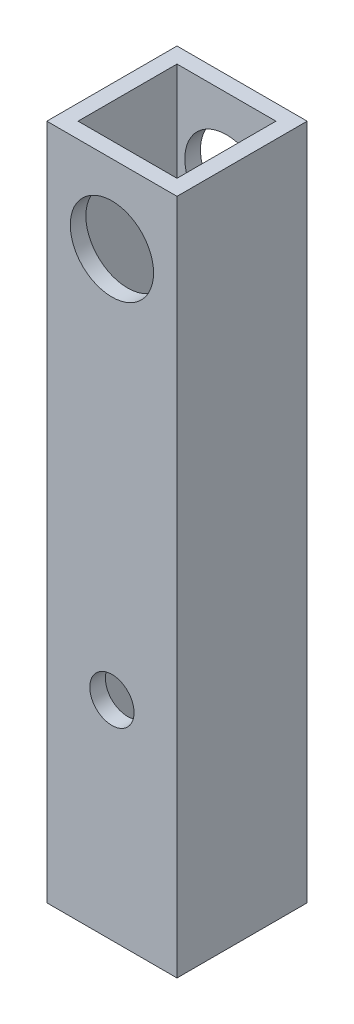
ISO-10303-21;
HEADER;
FILE_DESCRIPTION(('STEP AP214'),'2;1');
FILE_NAME('part.step','',(''),(''),'','','');
FILE_SCHEMA(('AUTOMOTIVE_DESIGN { 1 0 10303 214 1 1 1 1 }'));
ENDSEC;
DATA;
#1=APPLICATION_CONTEXT('core data for automotive mechanical design processes');
#2=APPLICATION_PROTOCOL_DEFINITION('international standard','automotive_design',2000,#1);
#3=PRODUCT_CONTEXT('',#1,'mechanical');
#4=PRODUCT('Part','Part','',(#3));
#5=PRODUCT_RELATED_PRODUCT_CATEGORY('part','',(#4));
#6=PRODUCT_DEFINITION_FORMATION('','',#4);
#7=PRODUCT_DEFINITION_CONTEXT('part definition',#1,'design');
#8=PRODUCT_DEFINITION('design','',#6,#7);
#9=PRODUCT_DEFINITION_SHAPE('','',#8);
#10=(LENGTH_UNIT() NAMED_UNIT(*) SI_UNIT(.MILLI.,.METRE.));
#11=(NAMED_UNIT(*) PLANE_ANGLE_UNIT() SI_UNIT($,.RADIAN.));
#12=(NAMED_UNIT(*) SI_UNIT($,.STERADIAN.) SOLID_ANGLE_UNIT());
#13=UNCERTAINTY_MEASURE_WITH_UNIT(LENGTH_MEASURE(1.E-05),#10,'distance_accuracy_value','');
#14=(GEOMETRIC_REPRESENTATION_CONTEXT(3) GLOBAL_UNCERTAINTY_ASSIGNED_CONTEXT((#13)) GLOBAL_UNIT_ASSIGNED_CONTEXT((#10,
#11,#12)) REPRESENTATION_CONTEXT('',''));
#15=CARTESIAN_POINT('',(0.,0.,0.));
#16=DIRECTION('',(0.,0.,1.));
#17=DIRECTION('',(1.,0.,0.));
#18=AXIS2_PLACEMENT_3D('',#15,#16,#17);
#19=CARTESIAN_POINT('',(0.,130.,0.));
#20=DIRECTION('',(0.,-1.,0.));
#21=DIRECTION('',(0.,0.,-1.));
#22=AXIS2_PLACEMENT_3D('',#19,#20,#21);
#23=PLANE('',#22);
#24=DIRECTION('',(0.,0.,1.));
#25=VECTOR('',#24,1.);
#26=CARTESIAN_POINT('',(0.,130.,0.));
#27=LINE('',#26,#25);
#28=CARTESIAN_POINT('',(0.,130.,-25.));
#29=VERTEX_POINT('',#28);
#30=CARTESIAN_POINT('',(0.,130.,0.));
#31=VERTEX_POINT('',#30);
#32=EDGE_CURVE('E140',#29,#31,#27,.T.);
#33=ORIENTED_EDGE('',*,*,#32,.T.);
#34=DIRECTION('',(1.,0.,0.));
#35=VECTOR('',#34,1.);
#36=CARTESIAN_POINT('',(0.,130.,0.));
#37=LINE('',#36,#35);
#38=CARTESIAN_POINT('',(25.,130.,0.));
#39=VERTEX_POINT('',#38);
#40=EDGE_CURVE('E143',#31,#39,#37,.T.);
#41=ORIENTED_EDGE('',*,*,#40,.T.);
#42=DIRECTION('',(0.,0.,-1.));
#43=VECTOR('',#42,1.);
#44=CARTESIAN_POINT('',(25.,130.,0.));
#45=LINE('',#44,#43);
#46=CARTESIAN_POINT('',(25.,130.,-25.));
#47=VERTEX_POINT('',#46);
#48=EDGE_CURVE('E146',#39,#47,#45,.T.);
#49=ORIENTED_EDGE('',*,*,#48,.T.);
#50=DIRECTION('',(-1.,0.,0.));
#51=VECTOR('',#50,1.);
#52=CARTESIAN_POINT('',(0.,130.,-25.));
#53=LINE('',#52,#51);
#54=EDGE_CURVE('E148',#47,#29,#53,.T.);
#55=ORIENTED_EDGE('',*,*,#54,.T.);
#56=EDGE_LOOP('',(#33,#41,#49,#55));
#57=FACE_BOUND('',#56,.T.);
#58=DIRECTION('',(0.,0.,1.));
#59=VECTOR('',#58,1.);
#60=CARTESIAN_POINT('',(3.,130.,-3.));
#61=LINE('',#60,#59);
#62=CARTESIAN_POINT('',(3.,130.,-22.));
#63=VERTEX_POINT('',#62);
#64=CARTESIAN_POINT('',(3.,130.,-3.));
#65=VERTEX_POINT('',#64);
#66=EDGE_CURVE('E102',#63,#65,#61,.T.);
#67=ORIENTED_EDGE('',*,*,#66,.F.);
#68=DIRECTION('',(-1.,0.,0.));
#69=VECTOR('',#68,1.);
#70=CARTESIAN_POINT('',(3.,130.,-22.));
#71=LINE('',#70,#69);
#72=CARTESIAN_POINT('',(22.,130.,-22.));
#73=VERTEX_POINT('',#72);
#74=EDGE_CURVE('E124',#73,#63,#71,.T.);
#75=ORIENTED_EDGE('',*,*,#74,.F.);
#76=DIRECTION('',(0.,0.,-1.));
#77=VECTOR('',#76,1.);
#78=CARTESIAN_POINT('',(22.,130.,-3.));
#79=LINE('',#78,#77);
#80=CARTESIAN_POINT('',(22.,130.,-3.));
#81=VERTEX_POINT('',#80);
#82=EDGE_CURVE('E122',#81,#73,#79,.T.);
#83=ORIENTED_EDGE('',*,*,#82,.F.);
#84=DIRECTION('',(1.,0.,0.));
#85=VECTOR('',#84,1.);
#86=CARTESIAN_POINT('',(3.,130.,-3.));
#87=LINE('',#86,#85);
#88=EDGE_CURVE('E110',#65,#81,#87,.T.);
#89=ORIENTED_EDGE('',*,*,#88,.F.);
#90=EDGE_LOOP('',(#67,#75,#83,#89));
#91=FACE_BOUND('',#90,.T.);
#92=ADVANCED_FACE('F35',(#57,#91),#23,.F.);
#93=CARTESIAN_POINT('',(0.,0.,0.));
#94=DIRECTION('',(0.,-1.,0.));
#95=DIRECTION('',(0.,0.,-1.));
#96=AXIS2_PLACEMENT_3D('',#93,#94,#95);
#97=PLANE('',#96);
#98=DIRECTION('',(0.,0.,1.));
#99=VECTOR('',#98,1.);
#100=CARTESIAN_POINT('',(0.,0.,0.));
#101=LINE('',#100,#99);
#102=CARTESIAN_POINT('',(0.,0.,-25.));
#103=VERTEX_POINT('',#102);
#104=CARTESIAN_POINT('',(0.,0.,0.));
#105=VERTEX_POINT('',#104);
#106=EDGE_CURVE('E118',#103,#105,#101,.T.);
#107=ORIENTED_EDGE('',*,*,#106,.F.);
#108=DIRECTION('',(-1.,0.,0.));
#109=VECTOR('',#108,1.);
#110=CARTESIAN_POINT('',(0.,0.,-25.));
#111=LINE('',#110,#109);
#112=CARTESIAN_POINT('',(25.,0.,-25.));
#113=VERTEX_POINT('',#112);
#114=EDGE_CURVE('E144',#113,#103,#111,.T.);
#115=ORIENTED_EDGE('',*,*,#114,.F.);
#116=DIRECTION('',(0.,0.,-1.));
#117=VECTOR('',#116,1.);
#118=CARTESIAN_POINT('',(25.,0.,0.));
#119=LINE('',#118,#117);
#120=CARTESIAN_POINT('',(25.,0.,0.));
#121=VERTEX_POINT('',#120);
#122=EDGE_CURVE('E155',#121,#113,#119,.T.);
#123=ORIENTED_EDGE('',*,*,#122,.F.);
#124=DIRECTION('',(1.,0.,0.));
#125=VECTOR('',#124,1.);
#126=CARTESIAN_POINT('',(0.,0.,0.));
#127=LINE('',#126,#125);
#128=EDGE_CURVE('E153',#105,#121,#127,.T.);
#129=ORIENTED_EDGE('',*,*,#128,.F.);
#130=EDGE_LOOP('',(#107,#115,#123,#129));
#131=FACE_BOUND('',#130,.T.);
#132=DIRECTION('',(-1.,0.,0.));
#133=VECTOR('',#132,1.);
#134=CARTESIAN_POINT('',(3.,0.,-22.));
#135=LINE('',#134,#133);
#136=CARTESIAN_POINT('',(22.,0.,-22.));
#137=VERTEX_POINT('',#136);
#138=CARTESIAN_POINT('',(3.,0.,-22.));
#139=VERTEX_POINT('',#138);
#140=EDGE_CURVE('E111',#137,#139,#135,.T.);
#141=ORIENTED_EDGE('',*,*,#140,.T.);
#142=DIRECTION('',(0.,0.,1.));
#143=VECTOR('',#142,1.);
#144=CARTESIAN_POINT('',(3.,0.,-3.));
#145=LINE('',#144,#143);
#146=CARTESIAN_POINT('',(3.,0.,-3.));
#147=VERTEX_POINT('',#146);
#148=EDGE_CURVE('E60',#139,#147,#145,.T.);
#149=ORIENTED_EDGE('',*,*,#148,.T.);
#150=DIRECTION('',(1.,0.,0.));
#151=VECTOR('',#150,1.);
#152=CARTESIAN_POINT('',(3.,0.,-3.));
#153=LINE('',#152,#151);
#154=CARTESIAN_POINT('',(22.,0.,-3.));
#155=VERTEX_POINT('',#154);
#156=EDGE_CURVE('E117',#147,#155,#153,.T.);
#157=ORIENTED_EDGE('',*,*,#156,.T.);
#158=DIRECTION('',(0.,0.,-1.));
#159=VECTOR('',#158,1.);
#160=CARTESIAN_POINT('',(22.,0.,-3.));
#161=LINE('',#160,#159);
#162=EDGE_CURVE('E132',#155,#137,#161,.T.);
#163=ORIENTED_EDGE('',*,*,#162,.T.);
#164=EDGE_LOOP('',(#141,#149,#157,#163));
#165=FACE_BOUND('',#164,.T.);
#166=ADVANCED_FACE('F202',(#131,#165),#97,.T.);
#167=CARTESIAN_POINT('',(0.,130.,0.));
#168=DIRECTION('',(1.,0.,0.));
#169=DIRECTION('',(0.,0.,-1.));
#170=AXIS2_PLACEMENT_3D('',#167,#168,#169);
#171=PLANE('',#170);
#172=ORIENTED_EDGE('',*,*,#106,.T.);
#173=DIRECTION('',(0.,-1.,0.));
#174=VECTOR('',#173,1.);
#175=CARTESIAN_POINT('',(0.,130.,0.));
#176=LINE('',#175,#174);
#177=EDGE_CURVE('E11',#31,#105,#176,.T.);
#178=ORIENTED_EDGE('',*,*,#177,.F.);
#179=ORIENTED_EDGE('',*,*,#32,.F.);
#180=DIRECTION('',(0.,-1.,0.));
#181=VECTOR('',#180,1.);
#182=CARTESIAN_POINT('',(0.,130.,-25.));
#183=LINE('',#182,#181);
#184=EDGE_CURVE('E150',#29,#103,#183,.T.);
#185=ORIENTED_EDGE('',*,*,#184,.T.);
#186=EDGE_LOOP('',(#172,#178,#179,#185));
#187=FACE_BOUND('',#186,.T.);
#188=ADVANCED_FACE('F37',(#187),#171,.F.);
#189=CARTESIAN_POINT('',(0.,130.,0.));
#190=DIRECTION('',(0.,0.,-1.));
#191=DIRECTION('',(-1.,0.,0.));
#192=AXIS2_PLACEMENT_3D('',#189,#190,#191);
#193=PLANE('',#192);
#194=CARTESIAN_POINT('',(12.5,40.,0.));
#195=DIRECTION('',(0.,0.,1.));
#196=DIRECTION('',(1.,0.,0.));
#197=AXIS2_PLACEMENT_3D('',#194,#195,#196);
#198=CIRCLE('',#197,4.25);
#199=CARTESIAN_POINT('',(16.75,40.,0.));
#200=VERTEX_POINT('',#199);
#201=EDGE_CURVE('E173',#200,#200,#198,.T.);
#202=ORIENTED_EDGE('',*,*,#201,.F.);
#203=EDGE_LOOP('',(#202));
#204=FACE_BOUND('',#203,.T.);
#205=CARTESIAN_POINT('',(12.5,115.,0.));
#206=DIRECTION('',(0.,0.,1.));
#207=DIRECTION('',(1.,0.,0.));
#208=AXIS2_PLACEMENT_3D('',#205,#206,#207);
#209=CIRCLE('',#208,8.00000000000001);
#210=CARTESIAN_POINT('',(20.5,115.,0.));
#211=VERTEX_POINT('',#210);
#212=EDGE_CURVE('E183',#211,#211,#209,.T.);
#213=ORIENTED_EDGE('',*,*,#212,.F.);
#214=EDGE_LOOP('',(#213));
#215=FACE_BOUND('',#214,.T.);
#216=ORIENTED_EDGE('',*,*,#128,.T.);
#217=DIRECTION('',(0.,-1.,0.));
#218=VECTOR('',#217,1.);
#219=CARTESIAN_POINT('',(25.,130.,0.));
#220=LINE('',#219,#218);
#221=EDGE_CURVE('E44',#39,#121,#220,.T.);
#222=ORIENTED_EDGE('',*,*,#221,.F.);
#223=ORIENTED_EDGE('',*,*,#40,.F.);
#224=ORIENTED_EDGE('',*,*,#177,.T.);
#225=EDGE_LOOP('',(#216,#222,#223,#224));
#226=FACE_BOUND('',#225,.T.);
#227=ADVANCED_FACE('F226',(#204,#215,#226),#193,.F.);
#228=CARTESIAN_POINT('',(25.,130.,0.));
#229=DIRECTION('',(-1.,0.,0.));
#230=DIRECTION('',(0.,0.,1.));
#231=AXIS2_PLACEMENT_3D('',#228,#229,#230);
#232=PLANE('',#231);
#233=ORIENTED_EDGE('',*,*,#122,.T.);
#234=DIRECTION('',(0.,-1.,0.));
#235=VECTOR('',#234,1.);
#236=CARTESIAN_POINT('',(25.,130.,-25.));
#237=LINE('',#236,#235);
#238=EDGE_CURVE('E160',#47,#113,#237,.T.);
#239=ORIENTED_EDGE('',*,*,#238,.F.);
#240=ORIENTED_EDGE('',*,*,#48,.F.);
#241=ORIENTED_EDGE('',*,*,#221,.T.);
#242=EDGE_LOOP('',(#233,#239,#240,#241));
#243=FACE_BOUND('',#242,.T.);
#244=ADVANCED_FACE('F224',(#243),#232,.F.);
#245=CARTESIAN_POINT('',(0.,130.,-25.));
#246=DIRECTION('',(0.,0.,1.));
#247=DIRECTION('',(1.,0.,0.));
#248=AXIS2_PLACEMENT_3D('',#245,#246,#247);
#249=PLANE('',#248);
#250=CARTESIAN_POINT('',(12.5,40.,-25.));
#251=DIRECTION('',(0.,0.,1.));
#252=DIRECTION('',(1.,0.,0.));
#253=AXIS2_PLACEMENT_3D('',#250,#251,#252);
#254=CIRCLE('',#253,4.25);
#255=CARTESIAN_POINT('',(16.75,40.,-25.));
#256=VERTEX_POINT('',#255);
#257=EDGE_CURVE('E167',#256,#256,#254,.T.);
#258=ORIENTED_EDGE('',*,*,#257,.T.);
#259=EDGE_LOOP('',(#258));
#260=FACE_BOUND('',#259,.T.);
#261=CARTESIAN_POINT('',(12.5,115.,-25.));
#262=DIRECTION('',(0.,0.,1.));
#263=DIRECTION('',(1.,0.,0.));
#264=AXIS2_PLACEMENT_3D('',#261,#262,#263);
#265=CIRCLE('',#264,8.00000000000001);
#266=CARTESIAN_POINT('',(20.5,115.,-25.));
#267=VERTEX_POINT('',#266);
#268=EDGE_CURVE('E178',#267,#267,#265,.T.);
#269=ORIENTED_EDGE('',*,*,#268,.T.);
#270=EDGE_LOOP('',(#269));
#271=FACE_BOUND('',#270,.T.);
#272=ORIENTED_EDGE('',*,*,#114,.T.);
#273=ORIENTED_EDGE('',*,*,#184,.F.);
#274=ORIENTED_EDGE('',*,*,#54,.F.);
#275=ORIENTED_EDGE('',*,*,#238,.T.);
#276=EDGE_LOOP('',(#272,#273,#274,#275));
#277=FACE_BOUND('',#276,.T.);
#278=ADVANCED_FACE('F221',(#260,#271,#277),#249,.F.);
#279=CARTESIAN_POINT('',(3.,130.,-3.));
#280=DIRECTION('',(1.,0.,0.));
#281=DIRECTION('',(0.,0.,-1.));
#282=AXIS2_PLACEMENT_3D('',#279,#280,#281);
#283=PLANE('',#282);
#284=ORIENTED_EDGE('',*,*,#148,.F.);
#285=DIRECTION('',(0.,-1.,0.));
#286=VECTOR('',#285,1.);
#287=CARTESIAN_POINT('',(3.,130.,-22.));
#288=LINE('',#287,#286);
#289=EDGE_CURVE('E106',#63,#139,#288,.T.);
#290=ORIENTED_EDGE('',*,*,#289,.F.);
#291=ORIENTED_EDGE('',*,*,#66,.T.);
#292=DIRECTION('',(0.,-1.,0.));
#293=VECTOR('',#292,1.);
#294=CARTESIAN_POINT('',(3.,130.,-3.));
#295=LINE('',#294,#293);
#296=EDGE_CURVE('E105',#65,#147,#295,.T.);
#297=ORIENTED_EDGE('',*,*,#296,.T.);
#298=EDGE_LOOP('',(#284,#290,#291,#297));
#299=FACE_BOUND('',#298,.T.);
#300=ADVANCED_FACE('F104',(#299),#283,.T.);
#301=CARTESIAN_POINT('',(3.,130.,-3.));
#302=DIRECTION('',(0.,0.,-1.));
#303=DIRECTION('',(-1.,0.,0.));
#304=AXIS2_PLACEMENT_3D('',#301,#302,#303);
#305=PLANE('',#304);
#306=CARTESIAN_POINT('',(12.5,40.,-3.));
#307=DIRECTION('',(0.,0.,-1.));
#308=DIRECTION('',(-1.,0.,0.));
#309=AXIS2_PLACEMENT_3D('',#306,#307,#308);
#310=CIRCLE('',#309,4.25);
#311=CARTESIAN_POINT('',(8.25,40.,-3.));
#312=VERTEX_POINT('',#311);
#313=EDGE_CURVE('E130',#312,#312,#310,.T.);
#314=ORIENTED_EDGE('',*,*,#313,.F.);
#315=EDGE_LOOP('',(#314));
#316=FACE_BOUND('',#315,.T.);
#317=CARTESIAN_POINT('',(12.5,115.,-3.));
#318=DIRECTION('',(0.,0.,-1.));
#319=DIRECTION('',(-1.,0.,0.));
#320=AXIS2_PLACEMENT_3D('',#317,#318,#319);
#321=CIRCLE('',#320,8.00000000000001);
#322=CARTESIAN_POINT('',(4.5,115.,-3.));
#323=VERTEX_POINT('',#322);
#324=EDGE_CURVE('E166',#323,#323,#321,.T.);
#325=ORIENTED_EDGE('',*,*,#324,.F.);
#326=EDGE_LOOP('',(#325));
#327=FACE_BOUND('',#326,.T.);
#328=ORIENTED_EDGE('',*,*,#156,.F.);
#329=ORIENTED_EDGE('',*,*,#296,.F.);
#330=ORIENTED_EDGE('',*,*,#88,.T.);
#331=DIRECTION('',(0.,-1.,0.));
#332=VECTOR('',#331,1.);
#333=CARTESIAN_POINT('',(22.,130.,-3.));
#334=LINE('',#333,#332);
#335=EDGE_CURVE('E119',#81,#155,#334,.T.);
#336=ORIENTED_EDGE('',*,*,#335,.T.);
#337=EDGE_LOOP('',(#328,#329,#330,#336));
#338=FACE_BOUND('',#337,.T.);
#339=ADVANCED_FACE('F114',(#316,#327,#338),#305,.T.);
#340=CARTESIAN_POINT('',(22.,130.,-3.));
#341=DIRECTION('',(-1.,0.,0.));
#342=DIRECTION('',(0.,0.,1.));
#343=AXIS2_PLACEMENT_3D('',#340,#341,#342);
#344=PLANE('',#343);
#345=ORIENTED_EDGE('',*,*,#162,.F.);
#346=ORIENTED_EDGE('',*,*,#335,.F.);
#347=ORIENTED_EDGE('',*,*,#82,.T.);
#348=DIRECTION('',(0.,-1.,0.));
#349=VECTOR('',#348,1.);
#350=CARTESIAN_POINT('',(22.,130.,-22.));
#351=LINE('',#350,#349);
#352=EDGE_CURVE('E52',#73,#137,#351,.T.);
#353=ORIENTED_EDGE('',*,*,#352,.T.);
#354=EDGE_LOOP('',(#345,#346,#347,#353));
#355=FACE_BOUND('',#354,.T.);
#356=ADVANCED_FACE('F198',(#355),#344,.T.);
#357=CARTESIAN_POINT('',(3.,130.,-22.));
#358=DIRECTION('',(0.,0.,1.));
#359=DIRECTION('',(1.,0.,0.));
#360=AXIS2_PLACEMENT_3D('',#357,#358,#359);
#361=PLANE('',#360);
#362=CARTESIAN_POINT('',(12.5,40.,-22.));
#363=DIRECTION('',(0.,0.,1.));
#364=DIRECTION('',(1.,0.,0.));
#365=AXIS2_PLACEMENT_3D('',#362,#363,#364);
#366=CIRCLE('',#365,4.25);
#367=CARTESIAN_POINT('',(16.75,40.,-22.));
#368=VERTEX_POINT('',#367);
#369=EDGE_CURVE('E39',#368,#368,#366,.T.);
#370=ORIENTED_EDGE('',*,*,#369,.F.);
#371=EDGE_LOOP('',(#370));
#372=FACE_BOUND('',#371,.T.);
#373=CARTESIAN_POINT('',(12.5,115.,-22.));
#374=DIRECTION('',(0.,0.,1.));
#375=DIRECTION('',(1.,0.,0.));
#376=AXIS2_PLACEMENT_3D('',#373,#374,#375);
#377=CIRCLE('',#376,8.00000000000001);
#378=CARTESIAN_POINT('',(20.5,115.,-22.));
#379=VERTEX_POINT('',#378);
#380=EDGE_CURVE('E164',#379,#379,#377,.T.);
#381=ORIENTED_EDGE('',*,*,#380,.F.);
#382=EDGE_LOOP('',(#381));
#383=FACE_BOUND('',#382,.T.);
#384=ORIENTED_EDGE('',*,*,#140,.F.);
#385=ORIENTED_EDGE('',*,*,#352,.F.);
#386=ORIENTED_EDGE('',*,*,#74,.T.);
#387=ORIENTED_EDGE('',*,*,#289,.T.);
#388=EDGE_LOOP('',(#384,#385,#386,#387));
#389=FACE_BOUND('',#388,.T.);
#390=ADVANCED_FACE('F194',(#372,#383,#389),#361,.T.);
#391=CARTESIAN_POINT('',(12.5,115.,-25.));
#392=DIRECTION('',(0.,0.,1.));
#393=DIRECTION('',(1.,0.,0.));
#394=AXIS2_PLACEMENT_3D('',#391,#392,#393);
#395=CYLINDRICAL_SURFACE('',#394,8.00000000000001);
#396=ORIENTED_EDGE('',*,*,#380,.T.);
#397=EDGE_LOOP('',(#396));
#398=FACE_BOUND('',#397,.T.);
#399=ORIENTED_EDGE('',*,*,#268,.F.);
#400=EDGE_LOOP('',(#399));
#401=FACE_BOUND('',#400,.T.);
#402=ADVANCED_FACE('F197',(#398,#401),#395,.F.);
#403=CARTESIAN_POINT('',(12.5,40.,-25.));
#404=DIRECTION('',(0.,0.,1.));
#405=DIRECTION('',(1.,0.,0.));
#406=AXIS2_PLACEMENT_3D('',#403,#404,#405);
#407=CYLINDRICAL_SURFACE('',#406,4.25);
#408=ORIENTED_EDGE('',*,*,#369,.T.);
#409=EDGE_LOOP('',(#408));
#410=FACE_BOUND('',#409,.T.);
#411=ORIENTED_EDGE('',*,*,#257,.F.);
#412=EDGE_LOOP('',(#411));
#413=FACE_BOUND('',#412,.T.);
#414=ADVANCED_FACE('F191',(#410,#413),#407,.F.);
#415=ORIENTED_EDGE('',*,*,#324,.T.);
#416=EDGE_LOOP('',(#415));
#417=FACE_BOUND('',#416,.T.);
#418=ORIENTED_EDGE('',*,*,#212,.T.);
#419=EDGE_LOOP('',(#418));
#420=FACE_BOUND('',#419,.T.);
#421=ADVANCED_FACE('F250',(#417,#420),#395,.F.);
#422=ORIENTED_EDGE('',*,*,#313,.T.);
#423=EDGE_LOOP('',(#422));
#424=FACE_BOUND('',#423,.T.);
#425=ORIENTED_EDGE('',*,*,#201,.T.);
#426=EDGE_LOOP('',(#425));
#427=FACE_BOUND('',#426,.T.);
#428=ADVANCED_FACE('F252',(#424,#427),#407,.F.);
#429=CLOSED_SHELL('',(#92,#166,#188,#227,#244,#278,#300,#339,#356,#390,#402,#414,#421,#428));
#430=MANIFOLD_SOLID_BREP('B2',#429);
#431=ADVANCED_BREP_SHAPE_REPRESENTATION('',(#18,#430),#14);
#432=SHAPE_DEFINITION_REPRESENTATION(#9,#431);
ENDSEC;
END-ISO-10303-21;
